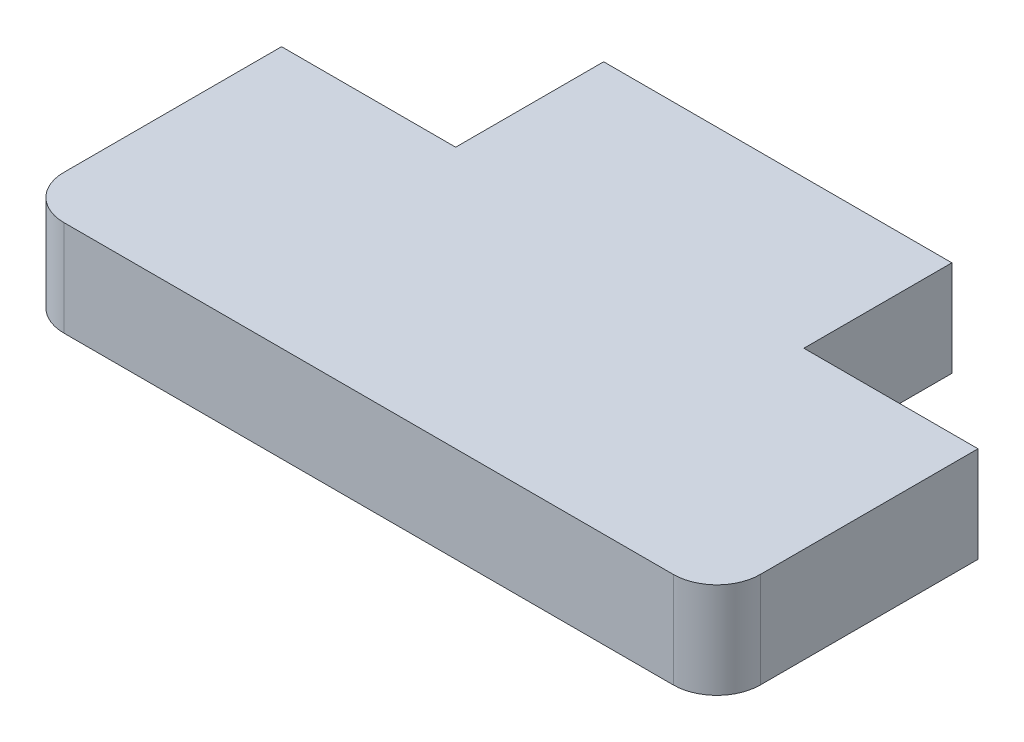
ISO-10303-21;
HEADER;
FILE_DESCRIPTION(('STEP AP214'),'2;1');
FILE_NAME('part.step','',(''),(''),'','','');
FILE_SCHEMA(('AUTOMOTIVE_DESIGN { 1 0 10303 214 1 1 1 1 }'));
ENDSEC;
DATA;
#1=APPLICATION_CONTEXT('core data for automotive mechanical design processes');
#2=APPLICATION_PROTOCOL_DEFINITION('international standard','automotive_design',2000,#1);
#3=PRODUCT_CONTEXT('',#1,'mechanical');
#4=PRODUCT('Part','Part','',(#3));
#5=PRODUCT_RELATED_PRODUCT_CATEGORY('part','',(#4));
#6=PRODUCT_DEFINITION_FORMATION('','',#4);
#7=PRODUCT_DEFINITION_CONTEXT('part definition',#1,'design');
#8=PRODUCT_DEFINITION('design','',#6,#7);
#9=PRODUCT_DEFINITION_SHAPE('','',#8);
#10=(LENGTH_UNIT() NAMED_UNIT(*) SI_UNIT(.MILLI.,.METRE.));
#11=(NAMED_UNIT(*) PLANE_ANGLE_UNIT() SI_UNIT($,.RADIAN.));
#12=(NAMED_UNIT(*) SI_UNIT($,.STERADIAN.) SOLID_ANGLE_UNIT());
#13=UNCERTAINTY_MEASURE_WITH_UNIT(LENGTH_MEASURE(1.E-05),#10,'distance_accuracy_value','');
#14=(GEOMETRIC_REPRESENTATION_CONTEXT(3) GLOBAL_UNCERTAINTY_ASSIGNED_CONTEXT((#13)) GLOBAL_UNIT_ASSIGNED_CONTEXT((#10,
#11,#12)) REPRESENTATION_CONTEXT('',''));
#15=CARTESIAN_POINT('',(0.,0.,0.));
#16=DIRECTION('',(0.,0.,1.));
#17=DIRECTION('',(1.,0.,0.));
#18=AXIS2_PLACEMENT_3D('',#15,#16,#17);
#19=CARTESIAN_POINT('',(0.,5.5,0.));
#20=DIRECTION('',(1.,0.,0.));
#21=DIRECTION('',(0.,0.,-1.));
#22=AXIS2_PLACEMENT_3D('',#19,#20,#21);
#23=PLANE('',#22);
#24=DIRECTION('',(0.,0.,1.));
#25=VECTOR('',#24,1.);
#26=CARTESIAN_POINT('',(0.,0.,0.));
#27=LINE('',#26,#25);
#28=CARTESIAN_POINT('',(0.,0.,-8.5));
#29=VERTEX_POINT('',#28);
#30=CARTESIAN_POINT('',(0.,0.,0.));
#31=VERTEX_POINT('',#30);
#32=EDGE_CURVE('E146',#29,#31,#27,.T.);
#33=ORIENTED_EDGE('',*,*,#32,.T.);
#34=DIRECTION('',(0.,-1.,0.));
#35=VECTOR('',#34,1.);
#36=CARTESIAN_POINT('',(0.,5.5,0.));
#37=LINE('',#36,#35);
#38=CARTESIAN_POINT('',(0.,5.5,0.));
#39=VERTEX_POINT('',#38);
#40=EDGE_CURVE('E128',#39,#31,#37,.T.);
#41=ORIENTED_EDGE('',*,*,#40,.F.);
#42=DIRECTION('',(0.,0.,1.));
#43=VECTOR('',#42,1.);
#44=CARTESIAN_POINT('',(0.,5.5,0.));
#45=LINE('',#44,#43);
#46=CARTESIAN_POINT('',(0.,5.5,-8.5));
#47=VERTEX_POINT('',#46);
#48=EDGE_CURVE('E134',#47,#39,#45,.T.);
#49=ORIENTED_EDGE('',*,*,#48,.F.);
#50=DIRECTION('',(0.,-1.,0.));
#51=VECTOR('',#50,1.);
#52=CARTESIAN_POINT('',(0.,5.5,-8.5));
#53=LINE('',#52,#51);
#54=EDGE_CURVE('E199',#47,#29,#53,.T.);
#55=ORIENTED_EDGE('',*,*,#54,.T.);
#56=EDGE_LOOP('',(#33,#41,#49,#55));
#57=FACE_BOUND('',#56,.T.);
#58=ADVANCED_FACE('F45',(#57),#23,.F.);
#59=CARTESIAN_POINT('',(0.,5.5,0.));
#60=DIRECTION('',(0.,0.,1.));
#61=DIRECTION('',(1.,0.,0.));
#62=AXIS2_PLACEMENT_3D('',#59,#60,#61);
#63=PLANE('',#62);
#64=DIRECTION('',(-1.,0.,0.));
#65=VECTOR('',#64,1.);
#66=CARTESIAN_POINT('',(0.,0.,0.));
#67=LINE('',#66,#65);
#68=CARTESIAN_POINT('',(-10.,0.,0.));
#69=VERTEX_POINT('',#68);
#70=EDGE_CURVE('E191',#31,#69,#67,.T.);
#71=ORIENTED_EDGE('',*,*,#70,.T.);
#72=DIRECTION('',(0.,-1.,0.));
#73=VECTOR('',#72,1.);
#74=CARTESIAN_POINT('',(-10.,5.5,0.));
#75=LINE('',#74,#73);
#76=CARTESIAN_POINT('',(-10.,5.5,0.));
#77=VERTEX_POINT('',#76);
#78=EDGE_CURVE('E131',#77,#69,#75,.T.);
#79=ORIENTED_EDGE('',*,*,#78,.F.);
#80=DIRECTION('',(-1.,0.,0.));
#81=VECTOR('',#80,1.);
#82=CARTESIAN_POINT('',(0.,5.5,0.));
#83=LINE('',#82,#81);
#84=EDGE_CURVE('E124',#39,#77,#83,.T.);
#85=ORIENTED_EDGE('',*,*,#84,.F.);
#86=ORIENTED_EDGE('',*,*,#40,.T.);
#87=EDGE_LOOP('',(#71,#79,#85,#86));
#88=FACE_BOUND('',#87,.T.);
#89=ADVANCED_FACE('F126',(#88),#63,.F.);
#90=CARTESIAN_POINT('',(-10.,5.5,0.));
#91=DIRECTION('',(1.,0.,0.));
#92=DIRECTION('',(0.,0.,-1.));
#93=AXIS2_PLACEMENT_3D('',#90,#91,#92);
#94=PLANE('',#93);
#95=DIRECTION('',(0.,0.,1.));
#96=VECTOR('',#95,1.);
#97=CARTESIAN_POINT('',(-10.,0.,0.));
#98=LINE('',#97,#96);
#99=CARTESIAN_POINT('',(-10.,0.,12.5));
#100=VERTEX_POINT('',#99);
#101=EDGE_CURVE('E187',#69,#100,#98,.T.);
#102=ORIENTED_EDGE('',*,*,#101,.T.);
#103=DIRECTION('',(0.,-1.,0.));
#104=VECTOR('',#103,1.);
#105=CARTESIAN_POINT('',(-10.,5.5,12.5));
#106=LINE('',#105,#104);
#107=CARTESIAN_POINT('',(-10.,5.5,12.5));
#108=VERTEX_POINT('',#107);
#109=EDGE_CURVE('E11',#100,#108,#106,.F.);
#110=ORIENTED_EDGE('',*,*,#109,.T.);
#111=DIRECTION('',(0.,0.,1.));
#112=VECTOR('',#111,1.);
#113=CARTESIAN_POINT('',(-10.,5.5,0.));
#114=LINE('',#113,#112);
#115=EDGE_CURVE('E133',#77,#108,#114,.T.);
#116=ORIENTED_EDGE('',*,*,#115,.F.);
#117=ORIENTED_EDGE('',*,*,#78,.T.);
#118=EDGE_LOOP('',(#102,#110,#116,#117));
#119=FACE_BOUND('',#118,.T.);
#120=ADVANCED_FACE('F223',(#119),#94,.F.);
#121=CARTESIAN_POINT('',(30.,5.5,15.));
#122=DIRECTION('',(0.,0.,-1.));
#123=DIRECTION('',(-1.,0.,0.));
#124=AXIS2_PLACEMENT_3D('',#121,#122,#123);
#125=PLANE('',#124);
#126=DIRECTION('',(1.,0.,0.));
#127=VECTOR('',#126,1.);
#128=CARTESIAN_POINT('',(30.,0.,15.));
#129=LINE('',#128,#127);
#130=CARTESIAN_POINT('',(-7.5,0.,15.));
#131=VERTEX_POINT('',#130);
#132=CARTESIAN_POINT('',(27.5,0.,15.));
#133=VERTEX_POINT('',#132);
#134=EDGE_CURVE('E182',#131,#133,#129,.T.);
#135=ORIENTED_EDGE('',*,*,#134,.T.);
#136=DIRECTION('',(0.,-1.,0.));
#137=VECTOR('',#136,1.);
#138=CARTESIAN_POINT('',(27.5,5.5,15.));
#139=LINE('',#138,#137);
#140=CARTESIAN_POINT('',(27.5,5.5,15.));
#141=VERTEX_POINT('',#140);
#142=EDGE_CURVE('E66',#133,#141,#139,.F.);
#143=ORIENTED_EDGE('',*,*,#142,.T.);
#144=DIRECTION('',(1.,0.,0.));
#145=VECTOR('',#144,1.);
#146=CARTESIAN_POINT('',(30.,5.5,15.));
#147=LINE('',#146,#145);
#148=CARTESIAN_POINT('',(-7.5,5.5,15.));
#149=VERTEX_POINT('',#148);
#150=EDGE_CURVE('E168',#149,#141,#147,.T.);
#151=ORIENTED_EDGE('',*,*,#150,.F.);
#152=DIRECTION('',(0.,-1.,0.));
#153=VECTOR('',#152,1.);
#154=CARTESIAN_POINT('',(-7.5,5.5,15.));
#155=LINE('',#154,#153);
#156=EDGE_CURVE('E159',#149,#131,#155,.T.);
#157=ORIENTED_EDGE('',*,*,#156,.T.);
#158=EDGE_LOOP('',(#135,#143,#151,#157));
#159=FACE_BOUND('',#158,.T.);
#160=ADVANCED_FACE('F185',(#159),#125,.F.);
#161=CARTESIAN_POINT('',(30.,5.5,0.));
#162=DIRECTION('',(-1.,0.,0.));
#163=DIRECTION('',(0.,0.,1.));
#164=AXIS2_PLACEMENT_3D('',#161,#162,#163);
#165=PLANE('',#164);
#166=DIRECTION('',(0.,0.,-1.));
#167=VECTOR('',#166,1.);
#168=CARTESIAN_POINT('',(30.,5.5,0.));
#169=LINE('',#168,#167);
#170=CARTESIAN_POINT('',(30.,5.5,12.5));
#171=VERTEX_POINT('',#170);
#172=CARTESIAN_POINT('',(30.,5.5,0.));
#173=VERTEX_POINT('',#172);
#174=EDGE_CURVE('E166',#171,#173,#169,.T.);
#175=ORIENTED_EDGE('',*,*,#174,.F.);
#176=DIRECTION('',(0.,-1.,0.));
#177=VECTOR('',#176,1.);
#178=CARTESIAN_POINT('',(30.,5.5,12.5));
#179=LINE('',#178,#177);
#180=CARTESIAN_POINT('',(30.,0.,12.5));
#181=VERTEX_POINT('',#180);
#182=EDGE_CURVE('E147',#171,#181,#179,.T.);
#183=ORIENTED_EDGE('',*,*,#182,.T.);
#184=DIRECTION('',(0.,0.,-1.));
#185=VECTOR('',#184,1.);
#186=CARTESIAN_POINT('',(30.,0.,0.));
#187=LINE('',#186,#185);
#188=CARTESIAN_POINT('',(30.,0.,0.));
#189=VERTEX_POINT('',#188);
#190=EDGE_CURVE('E184',#181,#189,#187,.T.);
#191=ORIENTED_EDGE('',*,*,#190,.T.);
#192=DIRECTION('',(0.,-1.,0.));
#193=VECTOR('',#192,1.);
#194=CARTESIAN_POINT('',(30.,5.5,0.));
#195=LINE('',#194,#193);
#196=EDGE_CURVE('E152',#173,#189,#195,.T.);
#197=ORIENTED_EDGE('',*,*,#196,.F.);
#198=EDGE_LOOP('',(#175,#183,#191,#197));
#199=FACE_BOUND('',#198,.T.);
#200=ADVANCED_FACE('F172',(#199),#165,.F.);
#201=CARTESIAN_POINT('',(30.,5.5,0.));
#202=DIRECTION('',(0.,0.,1.));
#203=DIRECTION('',(1.,0.,0.));
#204=AXIS2_PLACEMENT_3D('',#201,#202,#203);
#205=PLANE('',#204);
#206=DIRECTION('',(-1.,0.,0.));
#207=VECTOR('',#206,1.);
#208=CARTESIAN_POINT('',(30.,0.,0.));
#209=LINE('',#208,#207);
#210=CARTESIAN_POINT('',(20.,0.,0.));
#211=VERTEX_POINT('',#210);
#212=EDGE_CURVE('E189',#189,#211,#209,.T.);
#213=ORIENTED_EDGE('',*,*,#212,.T.);
#214=DIRECTION('',(0.,-1.,0.));
#215=VECTOR('',#214,1.);
#216=CARTESIAN_POINT('',(20.,5.5,0.));
#217=LINE('',#216,#215);
#218=CARTESIAN_POINT('',(20.,5.5,0.));
#219=VERTEX_POINT('',#218);
#220=EDGE_CURVE('E204',#219,#211,#217,.T.);
#221=ORIENTED_EDGE('',*,*,#220,.F.);
#222=DIRECTION('',(-1.,0.,0.));
#223=VECTOR('',#222,1.);
#224=CARTESIAN_POINT('',(30.,5.5,0.));
#225=LINE('',#224,#223);
#226=EDGE_CURVE('E176',#173,#219,#225,.T.);
#227=ORIENTED_EDGE('',*,*,#226,.F.);
#228=ORIENTED_EDGE('',*,*,#196,.T.);
#229=EDGE_LOOP('',(#213,#221,#227,#228));
#230=FACE_BOUND('',#229,.T.);
#231=ADVANCED_FACE('F207',(#230),#205,.F.);
#232=CARTESIAN_POINT('',(20.,5.5,0.));
#233=DIRECTION('',(-1.,0.,0.));
#234=DIRECTION('',(0.,0.,1.));
#235=AXIS2_PLACEMENT_3D('',#232,#233,#234);
#236=PLANE('',#235);
#237=DIRECTION('',(0.,0.,-1.));
#238=VECTOR('',#237,1.);
#239=CARTESIAN_POINT('',(20.,0.,0.));
#240=LINE('',#239,#238);
#241=CARTESIAN_POINT('',(20.,0.,-8.5));
#242=VERTEX_POINT('',#241);
#243=EDGE_CURVE('E196',#211,#242,#240,.T.);
#244=ORIENTED_EDGE('',*,*,#243,.T.);
#245=DIRECTION('',(0.,-1.,0.));
#246=VECTOR('',#245,1.);
#247=CARTESIAN_POINT('',(20.,5.5,-8.5));
#248=LINE('',#247,#246);
#249=CARTESIAN_POINT('',(20.,5.5,-8.5));
#250=VERTEX_POINT('',#249);
#251=EDGE_CURVE('E201',#250,#242,#248,.T.);
#252=ORIENTED_EDGE('',*,*,#251,.F.);
#253=DIRECTION('',(0.,0.,-1.));
#254=VECTOR('',#253,1.);
#255=CARTESIAN_POINT('',(20.,5.5,0.));
#256=LINE('',#255,#254);
#257=EDGE_CURVE('E217',#219,#250,#256,.T.);
#258=ORIENTED_EDGE('',*,*,#257,.F.);
#259=ORIENTED_EDGE('',*,*,#220,.T.);
#260=EDGE_LOOP('',(#244,#252,#258,#259));
#261=FACE_BOUND('',#260,.T.);
#262=ADVANCED_FACE('F213',(#261),#236,.F.);
#263=CARTESIAN_POINT('',(0.,5.5,-8.5));
#264=DIRECTION('',(0.,0.,1.));
#265=DIRECTION('',(1.,0.,0.));
#266=AXIS2_PLACEMENT_3D('',#263,#264,#265);
#267=PLANE('',#266);
#268=DIRECTION('',(-1.,0.,0.));
#269=VECTOR('',#268,1.);
#270=CARTESIAN_POINT('',(0.,0.,-8.5));
#271=LINE('',#270,#269);
#272=EDGE_CURVE('E143',#242,#29,#271,.T.);
#273=ORIENTED_EDGE('',*,*,#272,.T.);
#274=ORIENTED_EDGE('',*,*,#54,.F.);
#275=DIRECTION('',(-1.,0.,0.));
#276=VECTOR('',#275,1.);
#277=CARTESIAN_POINT('',(0.,5.5,-8.5));
#278=LINE('',#277,#276);
#279=EDGE_CURVE('E139',#250,#47,#278,.T.);
#280=ORIENTED_EDGE('',*,*,#279,.F.);
#281=ORIENTED_EDGE('',*,*,#251,.T.);
#282=EDGE_LOOP('',(#273,#274,#280,#281));
#283=FACE_BOUND('',#282,.T.);
#284=ADVANCED_FACE('F216',(#283),#267,.F.);
#285=CARTESIAN_POINT('',(0.,5.5,0.));
#286=DIRECTION('',(0.,-1.,0.));
#287=DIRECTION('',(0.,0.,-1.));
#288=AXIS2_PLACEMENT_3D('',#285,#286,#287);
#289=PLANE('',#288);
#290=ORIENTED_EDGE('',*,*,#150,.T.);
#291=CARTESIAN_POINT('',(27.5,5.5,12.5));
#292=DIRECTION('',(0.,-1.,0.));
#293=DIRECTION('',(0.,0.,-1.));
#294=AXIS2_PLACEMENT_3D('',#291,#292,#293);
#295=CIRCLE('',#294,2.5);
#296=EDGE_CURVE('E53',#141,#171,#295,.F.);
#297=ORIENTED_EDGE('',*,*,#296,.T.);
#298=ORIENTED_EDGE('',*,*,#174,.T.);
#299=ORIENTED_EDGE('',*,*,#226,.T.);
#300=ORIENTED_EDGE('',*,*,#257,.T.);
#301=ORIENTED_EDGE('',*,*,#279,.T.);
#302=ORIENTED_EDGE('',*,*,#48,.T.);
#303=ORIENTED_EDGE('',*,*,#84,.T.);
#304=ORIENTED_EDGE('',*,*,#115,.T.);
#305=CARTESIAN_POINT('',(-7.5,5.5,12.5));
#306=DIRECTION('',(0.,-1.,0.));
#307=DIRECTION('',(0.,0.,-1.));
#308=AXIS2_PLACEMENT_3D('',#305,#306,#307);
#309=CIRCLE('',#308,2.5);
#310=EDGE_CURVE('E163',#108,#149,#309,.F.);
#311=ORIENTED_EDGE('',*,*,#310,.T.);
#312=EDGE_LOOP('',(#290,#297,#298,#299,#300,#301,#302,#303,#304,#311));
#313=FACE_BOUND('',#312,.T.);
#314=ADVANCED_FACE('F137',(#313),#289,.F.);
#315=CARTESIAN_POINT('',(0.,0.,0.));
#316=DIRECTION('',(0.,-1.,0.));
#317=DIRECTION('',(0.,0.,-1.));
#318=AXIS2_PLACEMENT_3D('',#315,#316,#317);
#319=PLANE('',#318);
#320=ORIENTED_EDGE('',*,*,#190,.F.);
#321=CARTESIAN_POINT('',(27.5,0.,12.5));
#322=DIRECTION('',(0.,-1.,0.));
#323=DIRECTION('',(0.,0.,-1.));
#324=AXIS2_PLACEMENT_3D('',#321,#322,#323);
#325=CIRCLE('',#324,2.5);
#326=EDGE_CURVE('E157',#181,#133,#325,.T.);
#327=ORIENTED_EDGE('',*,*,#326,.T.);
#328=ORIENTED_EDGE('',*,*,#134,.F.);
#329=CARTESIAN_POINT('',(-7.5,0.,12.5));
#330=DIRECTION('',(0.,-1.,0.));
#331=DIRECTION('',(0.,0.,-1.));
#332=AXIS2_PLACEMENT_3D('',#329,#330,#331);
#333=CIRCLE('',#332,2.5);
#334=EDGE_CURVE('E150',#131,#100,#333,.T.);
#335=ORIENTED_EDGE('',*,*,#334,.T.);
#336=ORIENTED_EDGE('',*,*,#101,.F.);
#337=ORIENTED_EDGE('',*,*,#70,.F.);
#338=ORIENTED_EDGE('',*,*,#32,.F.);
#339=ORIENTED_EDGE('',*,*,#272,.F.);
#340=ORIENTED_EDGE('',*,*,#243,.F.);
#341=ORIENTED_EDGE('',*,*,#212,.F.);
#342=EDGE_LOOP('',(#320,#327,#328,#335,#336,#337,#338,#339,#340,#341));
#343=FACE_BOUND('',#342,.T.);
#344=ADVANCED_FACE('F181',(#343),#319,.T.);
#345=CARTESIAN_POINT('',(27.5,5.5,12.5));
#346=DIRECTION('',(0.,-1.,0.));
#347=DIRECTION('',(0.,0.,-1.));
#348=AXIS2_PLACEMENT_3D('',#345,#346,#347);
#349=CYLINDRICAL_SURFACE('',#348,2.5);
#350=ORIENTED_EDGE('',*,*,#296,.F.);
#351=ORIENTED_EDGE('',*,*,#142,.F.);
#352=ORIENTED_EDGE('',*,*,#326,.F.);
#353=ORIENTED_EDGE('',*,*,#182,.F.);
#354=EDGE_LOOP('',(#350,#351,#352,#353));
#355=FACE_BOUND('',#354,.T.);
#356=ADVANCED_FACE('F178',(#355),#349,.T.);
#357=CARTESIAN_POINT('',(-7.5,5.5,12.5));
#358=DIRECTION('',(0.,-1.,0.));
#359=DIRECTION('',(0.,0.,-1.));
#360=AXIS2_PLACEMENT_3D('',#357,#358,#359);
#361=CYLINDRICAL_SURFACE('',#360,2.5);
#362=ORIENTED_EDGE('',*,*,#310,.F.);
#363=ORIENTED_EDGE('',*,*,#109,.F.);
#364=ORIENTED_EDGE('',*,*,#334,.F.);
#365=ORIENTED_EDGE('',*,*,#156,.F.);
#366=EDGE_LOOP('',(#362,#363,#364,#365));
#367=FACE_BOUND('',#366,.T.);
#368=ADVANCED_FACE('F47',(#367),#361,.T.);
#369=CLOSED_SHELL('',(#58,#89,#120,#160,#200,#231,#262,#284,#314,#344,#356,#368));
#370=MANIFOLD_SOLID_BREP('B2',#369);
#371=ADVANCED_BREP_SHAPE_REPRESENTATION('',(#18,#370),#14);
#372=SHAPE_DEFINITION_REPRESENTATION(#9,#371);
ENDSEC;
END-ISO-10303-21;
